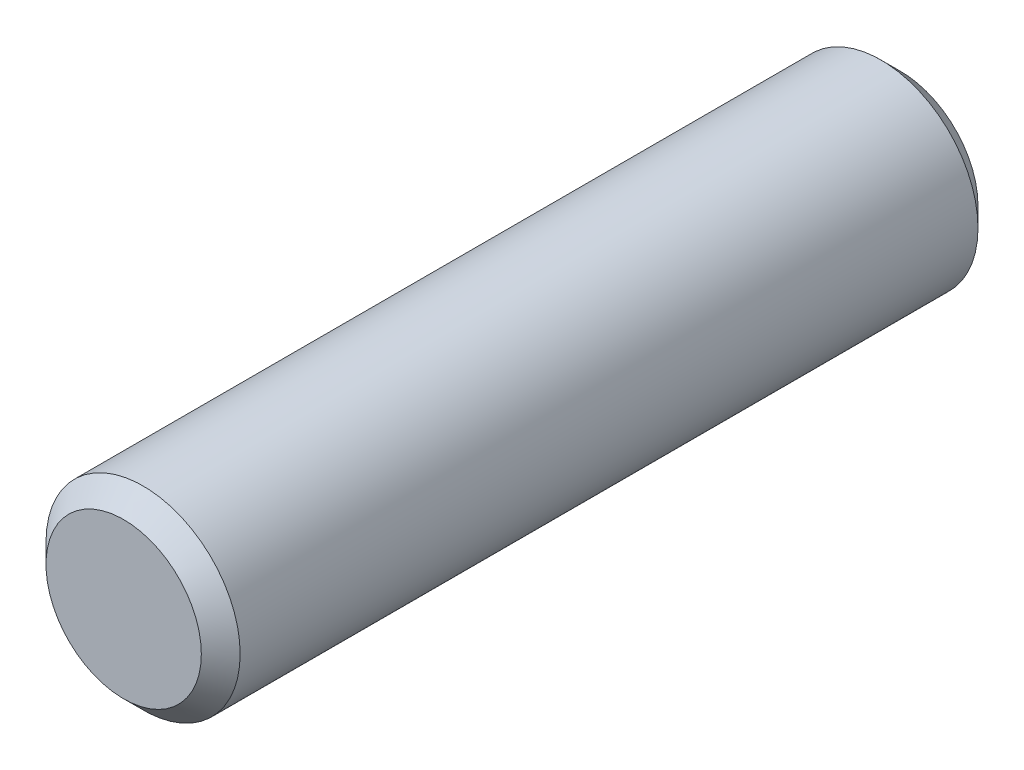
ISO-10303-21;
HEADER;
FILE_DESCRIPTION(('STEP AP214'),'2;1');
FILE_NAME('part.step','',(''),(''),'','','');
FILE_SCHEMA(('AUTOMOTIVE_DESIGN { 1 0 10303 214 1 1 1 1 }'));
ENDSEC;
DATA;
#1=APPLICATION_CONTEXT('core data for automotive mechanical design processes');
#2=APPLICATION_PROTOCOL_DEFINITION('international standard','automotive_design',2000,#1);
#3=PRODUCT_CONTEXT('',#1,'mechanical');
#4=PRODUCT('Part','Part','',(#3));
#5=PRODUCT_RELATED_PRODUCT_CATEGORY('part','',(#4));
#6=PRODUCT_DEFINITION_FORMATION('','',#4);
#7=PRODUCT_DEFINITION_CONTEXT('part definition',#1,'design');
#8=PRODUCT_DEFINITION('design','',#6,#7);
#9=PRODUCT_DEFINITION_SHAPE('','',#8);
#10=(LENGTH_UNIT() NAMED_UNIT(*) SI_UNIT(.MILLI.,.METRE.));
#11=(NAMED_UNIT(*) PLANE_ANGLE_UNIT() SI_UNIT($,.RADIAN.));
#12=(NAMED_UNIT(*) SI_UNIT($,.STERADIAN.) SOLID_ANGLE_UNIT());
#13=UNCERTAINTY_MEASURE_WITH_UNIT(LENGTH_MEASURE(1.E-05),#10,'distance_accuracy_value','');
#14=(GEOMETRIC_REPRESENTATION_CONTEXT(3) GLOBAL_UNCERTAINTY_ASSIGNED_CONTEXT((#13)) GLOBAL_UNIT_ASSIGNED_CONTEXT((#10,
#11,#12)) REPRESENTATION_CONTEXT('',''));
#15=CARTESIAN_POINT('',(0.,0.,0.));
#16=DIRECTION('',(0.,0.,1.));
#17=DIRECTION('',(1.,0.,0.));
#18=AXIS2_PLACEMENT_3D('',#15,#16,#17);
#19=CARTESIAN_POINT('',(0.,0.,14.));
#20=DIRECTION('',(0.,0.,-1.));
#21=DIRECTION('',(-1.,0.,0.));
#22=AXIS2_PLACEMENT_3D('',#19,#20,#21);
#23=CYLINDRICAL_SURFACE('',#22,3.5);
#24=CARTESIAN_POINT('',(0.,0.,-13.3));
#25=DIRECTION('',(0.,0.,1.));
#26=DIRECTION('',(1.,0.,0.));
#27=AXIS2_PLACEMENT_3D('',#24,#25,#26);
#28=CIRCLE('',#27,3.5);
#29=CARTESIAN_POINT('',(3.5,0.,-13.3));
#30=VERTEX_POINT('',#29);
#31=EDGE_CURVE('E42',#30,#30,#28,.T.);
#32=ORIENTED_EDGE('',*,*,#31,.T.);
#33=EDGE_LOOP('',(#32));
#34=FACE_BOUND('',#33,.T.);
#35=CARTESIAN_POINT('',(0.,0.,13.3));
#36=DIRECTION('',(0.,0.,1.));
#37=DIRECTION('',(1.,0.,0.));
#38=AXIS2_PLACEMENT_3D('',#35,#36,#37);
#39=CIRCLE('',#38,3.5);
#40=CARTESIAN_POINT('',(3.5,0.,13.3));
#41=VERTEX_POINT('',#40);
#42=EDGE_CURVE('E46',#41,#41,#39,.F.);
#43=ORIENTED_EDGE('',*,*,#42,.T.);
#44=EDGE_LOOP('',(#43));
#45=FACE_BOUND('',#44,.T.);
#46=ADVANCED_FACE('F31',(#34,#45),#23,.T.);
#47=CARTESIAN_POINT('',(0.,0.,14.));
#48=DIRECTION('',(0.,0.,1.));
#49=DIRECTION('',(1.,0.,0.));
#50=AXIS2_PLACEMENT_3D('',#47,#48,#49);
#51=PLANE('',#50);
#52=CARTESIAN_POINT('',(0.,0.,14.));
#53=DIRECTION('',(0.,0.,1.));
#54=DIRECTION('',(1.,0.,0.));
#55=AXIS2_PLACEMENT_3D('',#52,#53,#54);
#56=CIRCLE('',#55,2.8);
#57=CARTESIAN_POINT('',(2.8,0.,14.));
#58=VERTEX_POINT('',#57);
#59=EDGE_CURVE('E10',#58,#58,#56,.T.);
#60=ORIENTED_EDGE('',*,*,#59,.T.);
#61=EDGE_LOOP('',(#60));
#62=FACE_BOUND('',#61,.T.);
#63=ADVANCED_FACE('F62',(#62),#51,.T.);
#64=CARTESIAN_POINT('',(0.,0.,-14.));
#65=DIRECTION('',(0.,0.,1.));
#66=DIRECTION('',(1.,0.,0.));
#67=AXIS2_PLACEMENT_3D('',#64,#65,#66);
#68=PLANE('',#67);
#69=CARTESIAN_POINT('',(0.,0.,-14.));
#70=DIRECTION('',(0.,0.,1.));
#71=DIRECTION('',(1.,0.,0.));
#72=AXIS2_PLACEMENT_3D('',#69,#70,#71);
#73=CIRCLE('',#72,2.8);
#74=CARTESIAN_POINT('',(2.8,0.,-14.));
#75=VERTEX_POINT('',#74);
#76=EDGE_CURVE('E38',#75,#75,#73,.F.);
#77=ORIENTED_EDGE('',*,*,#76,.T.);
#78=EDGE_LOOP('',(#77));
#79=FACE_BOUND('',#78,.T.);
#80=ADVANCED_FACE('F59',(#79),#68,.F.);
#81=CARTESIAN_POINT('',(0.,0.,-13.3));
#82=DIRECTION('',(0.,0.,1.));
#83=DIRECTION('',(1.,0.,0.));
#84=AXIS2_PLACEMENT_3D('',#81,#82,#83);
#85=CONICAL_SURFACE('',#84,3.5,0.785398163397448);
#86=ORIENTED_EDGE('',*,*,#76,.F.);
#87=EDGE_LOOP('',(#86));
#88=FACE_BOUND('',#87,.T.);
#89=ORIENTED_EDGE('',*,*,#31,.F.);
#90=EDGE_LOOP('',(#89));
#91=FACE_BOUND('',#90,.T.);
#92=ADVANCED_FACE('F55',(#88,#91),#85,.T.);
#93=CARTESIAN_POINT('',(0.,0.,14.));
#94=DIRECTION('',(0.,0.,-1.));
#95=DIRECTION('',(-1.,0.,0.));
#96=AXIS2_PLACEMENT_3D('',#93,#94,#95);
#97=CONICAL_SURFACE('',#96,2.8,0.785398163397444);
#98=ORIENTED_EDGE('',*,*,#42,.F.);
#99=EDGE_LOOP('',(#98));
#100=FACE_BOUND('',#99,.T.);
#101=ORIENTED_EDGE('',*,*,#59,.F.);
#102=EDGE_LOOP('',(#101));
#103=FACE_BOUND('',#102,.T.);
#104=ADVANCED_FACE('F33',(#100,#103),#97,.T.);
#105=CLOSED_SHELL('',(#46,#63,#80,#92,#104));
#106=MANIFOLD_SOLID_BREP('B2',#105);
#107=ADVANCED_BREP_SHAPE_REPRESENTATION('',(#18,#106),#14);
#108=SHAPE_DEFINITION_REPRESENTATION(#9,#107);
ENDSEC;
END-ISO-10303-21;
